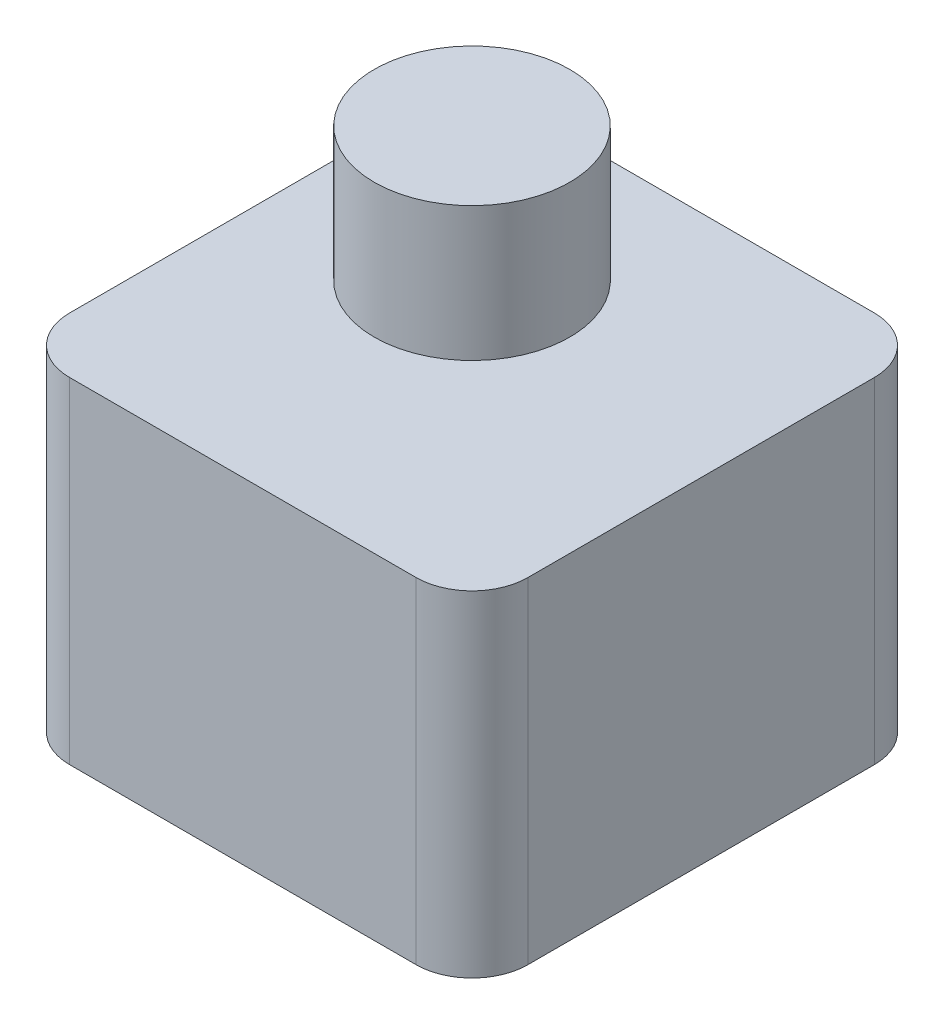
ISO-10303-21;
HEADER;
FILE_DESCRIPTION(('STEP AP214'),'2;1');
FILE_NAME('part.step','',(''),(''),'','','');
FILE_SCHEMA(('AUTOMOTIVE_DESIGN { 1 0 10303 214 1 1 1 1 }'));
ENDSEC;
DATA;
#1=APPLICATION_CONTEXT('core data for automotive mechanical design processes');
#2=APPLICATION_PROTOCOL_DEFINITION('international standard','automotive_design',2000,#1);
#3=PRODUCT_CONTEXT('',#1,'mechanical');
#4=PRODUCT('Part','Part','',(#3));
#5=PRODUCT_RELATED_PRODUCT_CATEGORY('part','',(#4));
#6=PRODUCT_DEFINITION_FORMATION('','',#4);
#7=PRODUCT_DEFINITION_CONTEXT('part definition',#1,'design');
#8=PRODUCT_DEFINITION('design','',#6,#7);
#9=PRODUCT_DEFINITION_SHAPE('','',#8);
#10=(LENGTH_UNIT() NAMED_UNIT(*) SI_UNIT(.MILLI.,.METRE.));
#11=(NAMED_UNIT(*) PLANE_ANGLE_UNIT() SI_UNIT($,.RADIAN.));
#12=(NAMED_UNIT(*) SI_UNIT($,.STERADIAN.) SOLID_ANGLE_UNIT());
#13=UNCERTAINTY_MEASURE_WITH_UNIT(LENGTH_MEASURE(1.E-05),#10,'distance_accuracy_value','');
#14=(GEOMETRIC_REPRESENTATION_CONTEXT(3) GLOBAL_UNCERTAINTY_ASSIGNED_CONTEXT((#13)) GLOBAL_UNIT_ASSIGNED_CONTEXT((#10,
#11,#12)) REPRESENTATION_CONTEXT('',''));
#15=CARTESIAN_POINT('',(0.,0.,0.));
#16=DIRECTION('',(0.,0.,1.));
#17=DIRECTION('',(1.,0.,0.));
#18=AXIS2_PLACEMENT_3D('',#15,#16,#17);
#19=CARTESIAN_POINT('',(20.5,47.,-20.5));
#20=DIRECTION('',(0.,-1.,0.));
#21=DIRECTION('',(0.,0.,-1.));
#22=AXIS2_PLACEMENT_3D('',#19,#20,#21);
#23=CYLINDRICAL_SURFACE('',#22,1.5);
#24=CARTESIAN_POINT('',(20.5,30.,-20.5));
#25=DIRECTION('',(0.,1.,0.));
#26=DIRECTION('',(0.,0.,1.));
#27=AXIS2_PLACEMENT_3D('',#24,#25,#26);
#28=CIRCLE('',#27,1.5);
#29=CARTESIAN_POINT('',(20.5,30.,-19.));
#30=VERTEX_POINT('',#29);
#31=EDGE_CURVE('E48',#30,#30,#28,.T.);
#32=ORIENTED_EDGE('',*,*,#31,.T.);
#33=EDGE_LOOP('',(#32));
#34=FACE_BOUND('',#33,.T.);
#35=CARTESIAN_POINT('',(20.5,35.,-20.5));
#36=DIRECTION('',(0.,1.,0.));
#37=DIRECTION('',(0.,0.,1.));
#38=AXIS2_PLACEMENT_3D('',#35,#36,#37);
#39=CIRCLE('',#38,1.5);
#40=CARTESIAN_POINT('',(20.5,35.,-19.));
#41=VERTEX_POINT('',#40);
#42=EDGE_CURVE('E11',#41,#41,#39,.T.);
#43=ORIENTED_EDGE('',*,*,#42,.F.);
#44=EDGE_LOOP('',(#43));
#45=FACE_BOUND('',#44,.T.);
#46=ADVANCED_FACE('F42',(#34,#45),#23,.T.);
#47=CARTESIAN_POINT('',(20.5,30.,-20.5));
#48=DIRECTION('',(0.,1.,0.));
#49=DIRECTION('',(0.,0.,1.));
#50=AXIS2_PLACEMENT_3D('',#47,#48,#49);
#51=PLANE('',#50);
#52=ORIENTED_EDGE('',*,*,#31,.F.);
#53=EDGE_LOOP('',(#52));
#54=FACE_BOUND('',#53,.T.);
#55=ADVANCED_FACE('F74',(#54),#51,.F.);
#56=CARTESIAN_POINT('',(20.5,47.,-20.5));
#57=DIRECTION('',(0.,-1.,0.));
#58=DIRECTION('',(0.,0.,-1.));
#59=AXIS2_PLACEMENT_3D('',#56,#57,#58);
#60=CYLINDRICAL_SURFACE('',#59,8.75);
#61=CARTESIAN_POINT('',(20.5,47.,-20.5));
#62=DIRECTION('',(0.,1.,0.));
#63=DIRECTION('',(0.,0.,1.));
#64=AXIS2_PLACEMENT_3D('',#61,#62,#63);
#65=CIRCLE('',#64,8.75);
#66=CARTESIAN_POINT('',(20.5,47.,-11.75));
#67=VERTEX_POINT('',#66);
#68=EDGE_CURVE('E52',#67,#67,#65,.T.);
#69=ORIENTED_EDGE('',*,*,#68,.F.);
#70=EDGE_LOOP('',(#69));
#71=FACE_BOUND('',#70,.T.);
#72=CARTESIAN_POINT('',(20.5,35.,-20.5));
#73=DIRECTION('',(0.,1.,0.));
#74=DIRECTION('',(0.,0.,1.));
#75=AXIS2_PLACEMENT_3D('',#72,#73,#74);
#76=CIRCLE('',#75,8.75);
#77=CARTESIAN_POINT('',(20.5,35.,-11.75));
#78=VERTEX_POINT('',#77);
#79=EDGE_CURVE('E56',#78,#78,#76,.T.);
#80=ORIENTED_EDGE('',*,*,#79,.T.);
#81=EDGE_LOOP('',(#80));
#82=FACE_BOUND('',#81,.T.);
#83=ADVANCED_FACE('F62',(#71,#82),#60,.T.);
#84=CARTESIAN_POINT('',(20.5,35.,-20.5));
#85=DIRECTION('',(0.,1.,0.));
#86=DIRECTION('',(0.,0.,1.));
#87=AXIS2_PLACEMENT_3D('',#84,#85,#86);
#88=PLANE('',#87);
#89=ORIENTED_EDGE('',*,*,#42,.T.);
#90=EDGE_LOOP('',(#89));
#91=FACE_BOUND('',#90,.T.);
#92=ORIENTED_EDGE('',*,*,#79,.F.);
#93=EDGE_LOOP('',(#92));
#94=FACE_BOUND('',#93,.T.);
#95=ADVANCED_FACE('F64',(#91,#94),#88,.F.);
#96=CARTESIAN_POINT('',(20.5,47.,-20.5));
#97=DIRECTION('',(0.,1.,0.));
#98=DIRECTION('',(0.,0.,1.));
#99=AXIS2_PLACEMENT_3D('',#96,#97,#98);
#100=PLANE('',#99);
#101=ORIENTED_EDGE('',*,*,#68,.T.);
#102=EDGE_LOOP('',(#101));
#103=FACE_BOUND('',#102,.T.);
#104=ADVANCED_FACE('F66',(#103),#100,.T.);
#105=CLOSED_SHELL('',(#46,#55,#83,#95,#104));
#106=MANIFOLD_SOLID_BREP('B2',#105);
#107=CARTESIAN_POINT('',(5.,30.,-5.));
#108=DIRECTION('',(0.,-1.,0.));
#109=DIRECTION('',(0.,0.,-1.));
#110=AXIS2_PLACEMENT_3D('',#107,#108,#109);
#111=CYLINDRICAL_SURFACE('',#110,5.);
#112=CARTESIAN_POINT('',(5.,0.,-5.));
#113=DIRECTION('',(0.,1.,0.));
#114=DIRECTION('',(0.,0.,1.));
#115=AXIS2_PLACEMENT_3D('',#112,#113,#114);
#116=CIRCLE('',#115,5.);
#117=CARTESIAN_POINT('',(0.,0.,-5.00000000000004));
#118=VERTEX_POINT('',#117);
#119=CARTESIAN_POINT('',(5.00000000000003,0.,0.));
#120=VERTEX_POINT('',#119);
#121=EDGE_CURVE('E211',#118,#120,#116,.T.);
#122=ORIENTED_EDGE('',*,*,#121,.T.);
#123=DIRECTION('',(0.,-1.,0.));
#124=VECTOR('',#123,1.);
#125=CARTESIAN_POINT('',(5.00000000000003,30.,0.));
#126=LINE('',#125,#124);
#127=CARTESIAN_POINT('',(5.00000000000003,30.,0.));
#128=VERTEX_POINT('',#127);
#129=EDGE_CURVE('E40',#128,#120,#126,.T.);
#130=ORIENTED_EDGE('',*,*,#129,.F.);
#131=CARTESIAN_POINT('',(5.,30.,-5.));
#132=DIRECTION('',(0.,1.,0.));
#133=DIRECTION('',(0.,0.,1.));
#134=AXIS2_PLACEMENT_3D('',#131,#132,#133);
#135=CIRCLE('',#134,5.);
#136=CARTESIAN_POINT('',(0.,30.,-5.00000000000004));
#137=VERTEX_POINT('',#136);
#138=EDGE_CURVE('E225',#137,#128,#135,.T.);
#139=ORIENTED_EDGE('',*,*,#138,.F.);
#140=DIRECTION('',(0.,-1.,0.));
#141=VECTOR('',#140,1.);
#142=CARTESIAN_POINT('',(0.,30.,-5.00000000000004));
#143=LINE('',#142,#141);
#144=EDGE_CURVE('E207',#137,#118,#143,.T.);
#145=ORIENTED_EDGE('',*,*,#144,.T.);
#146=EDGE_LOOP('',(#122,#130,#139,#145));
#147=FACE_BOUND('',#146,.T.);
#148=ADVANCED_FACE('F115',(#147),#111,.T.);
#149=CARTESIAN_POINT('',(5.00000000000003,30.,0.));
#150=DIRECTION('',(0.,0.,-1.));
#151=DIRECTION('',(-1.,0.,0.));
#152=AXIS2_PLACEMENT_3D('',#149,#150,#151);
#153=PLANE('',#152);
#154=DIRECTION('',(1.,0.,0.));
#155=VECTOR('',#154,1.);
#156=CARTESIAN_POINT('',(5.00000000000003,0.,0.));
#157=LINE('',#156,#155);
#158=CARTESIAN_POINT('',(36.,0.,0.));
#159=VERTEX_POINT('',#158);
#160=EDGE_CURVE('E214',#120,#159,#157,.T.);
#161=ORIENTED_EDGE('',*,*,#160,.T.);
#162=DIRECTION('',(0.,-1.,0.));
#163=VECTOR('',#162,1.);
#164=CARTESIAN_POINT('',(36.,30.,0.));
#165=LINE('',#164,#163);
#166=CARTESIAN_POINT('',(36.,30.,0.));
#167=VERTEX_POINT('',#166);
#168=EDGE_CURVE('E123',#167,#159,#165,.T.);
#169=ORIENTED_EDGE('',*,*,#168,.F.);
#170=DIRECTION('',(1.,0.,0.));
#171=VECTOR('',#170,1.);
#172=CARTESIAN_POINT('',(5.00000000000003,30.,0.));
#173=LINE('',#172,#171);
#174=EDGE_CURVE('E174',#128,#167,#173,.T.);
#175=ORIENTED_EDGE('',*,*,#174,.F.);
#176=ORIENTED_EDGE('',*,*,#129,.T.);
#177=EDGE_LOOP('',(#161,#169,#175,#176));
#178=FACE_BOUND('',#177,.T.);
#179=ADVANCED_FACE('F260',(#178),#153,.F.);
#180=CARTESIAN_POINT('',(36.,30.,-5.));
#181=DIRECTION('',(0.,-1.,0.));
#182=DIRECTION('',(0.,0.,-1.));
#183=AXIS2_PLACEMENT_3D('',#180,#181,#182);
#184=CYLINDRICAL_SURFACE('',#183,5.);
#185=CARTESIAN_POINT('',(36.,0.,-5.));
#186=DIRECTION('',(0.,1.,0.));
#187=DIRECTION('',(0.,0.,1.));
#188=AXIS2_PLACEMENT_3D('',#185,#186,#187);
#189=CIRCLE('',#188,5.);
#190=CARTESIAN_POINT('',(41.,0.,-5.00000000000004));
#191=VERTEX_POINT('',#190);
#192=EDGE_CURVE('E216',#159,#191,#189,.T.);
#193=ORIENTED_EDGE('',*,*,#192,.T.);
#194=DIRECTION('',(0.,-1.,0.));
#195=VECTOR('',#194,1.);
#196=CARTESIAN_POINT('',(41.,30.,-5.00000000000004));
#197=LINE('',#196,#195);
#198=CARTESIAN_POINT('',(41.,30.,-5.00000000000004));
#199=VERTEX_POINT('',#198);
#200=EDGE_CURVE('E232',#199,#191,#197,.T.);
#201=ORIENTED_EDGE('',*,*,#200,.F.);
#202=CARTESIAN_POINT('',(36.,30.,-5.));
#203=DIRECTION('',(0.,1.,0.));
#204=DIRECTION('',(0.,0.,1.));
#205=AXIS2_PLACEMENT_3D('',#202,#203,#204);
#206=CIRCLE('',#205,5.);
#207=EDGE_CURVE('E240',#167,#199,#206,.T.);
#208=ORIENTED_EDGE('',*,*,#207,.F.);
#209=ORIENTED_EDGE('',*,*,#168,.T.);
#210=EDGE_LOOP('',(#193,#201,#208,#209));
#211=FACE_BOUND('',#210,.T.);
#212=ADVANCED_FACE('F238',(#211),#184,.T.);
#213=CARTESIAN_POINT('',(41.,30.,-36.));
#214=DIRECTION('',(-1.,0.,0.));
#215=DIRECTION('',(0.,0.,1.));
#216=AXIS2_PLACEMENT_3D('',#213,#214,#215);
#217=PLANE('',#216);
#218=DIRECTION('',(0.,0.,-1.));
#219=VECTOR('',#218,1.);
#220=CARTESIAN_POINT('',(41.,0.,-36.));
#221=LINE('',#220,#219);
#222=CARTESIAN_POINT('',(41.,0.,-36.));
#223=VERTEX_POINT('',#222);
#224=EDGE_CURVE('E218',#191,#223,#221,.T.);
#225=ORIENTED_EDGE('',*,*,#224,.T.);
#226=DIRECTION('',(0.,-1.,0.));
#227=VECTOR('',#226,1.);
#228=CARTESIAN_POINT('',(41.,30.,-36.));
#229=LINE('',#228,#227);
#230=CARTESIAN_POINT('',(41.,30.,-36.));
#231=VERTEX_POINT('',#230);
#232=EDGE_CURVE('E229',#231,#223,#229,.T.);
#233=ORIENTED_EDGE('',*,*,#232,.F.);
#234=DIRECTION('',(0.,0.,-1.));
#235=VECTOR('',#234,1.);
#236=CARTESIAN_POINT('',(41.,30.,-36.));
#237=LINE('',#236,#235);
#238=EDGE_CURVE('E252',#199,#231,#237,.T.);
#239=ORIENTED_EDGE('',*,*,#238,.F.);
#240=ORIENTED_EDGE('',*,*,#200,.T.);
#241=EDGE_LOOP('',(#225,#233,#239,#240));
#242=FACE_BOUND('',#241,.T.);
#243=ADVANCED_FACE('F248',(#242),#217,.F.);
#244=CARTESIAN_POINT('',(36.,30.,-36.));
#245=DIRECTION('',(0.,-1.,0.));
#246=DIRECTION('',(0.,0.,-1.));
#247=AXIS2_PLACEMENT_3D('',#244,#245,#246);
#248=CYLINDRICAL_SURFACE('',#247,5.);
#249=CARTESIAN_POINT('',(36.,0.,-36.));
#250=DIRECTION('',(0.,1.,0.));
#251=DIRECTION('',(0.,0.,-1.));
#252=AXIS2_PLACEMENT_3D('',#249,#250,#251);
#253=CIRCLE('',#252,5.);
#254=CARTESIAN_POINT('',(36.,0.,-41.));
#255=VERTEX_POINT('',#254);
#256=EDGE_CURVE('E220',#223,#255,#253,.T.);
#257=ORIENTED_EDGE('',*,*,#256,.T.);
#258=DIRECTION('',(0.,-1.,0.));
#259=VECTOR('',#258,1.);
#260=CARTESIAN_POINT('',(36.,30.,-41.));
#261=LINE('',#260,#259);
#262=CARTESIAN_POINT('',(36.,30.,-41.));
#263=VERTEX_POINT('',#262);
#264=EDGE_CURVE('E202',#263,#255,#261,.T.);
#265=ORIENTED_EDGE('',*,*,#264,.F.);
#266=CARTESIAN_POINT('',(36.,30.,-36.));
#267=DIRECTION('',(0.,1.,0.));
#268=DIRECTION('',(0.,0.,-1.));
#269=AXIS2_PLACEMENT_3D('',#266,#267,#268);
#270=CIRCLE('',#269,5.);
#271=EDGE_CURVE('E193',#231,#263,#270,.T.);
#272=ORIENTED_EDGE('',*,*,#271,.F.);
#273=ORIENTED_EDGE('',*,*,#232,.T.);
#274=EDGE_LOOP('',(#257,#265,#272,#273));
#275=FACE_BOUND('',#274,.T.);
#276=ADVANCED_FACE('F251',(#275),#248,.T.);
#277=CARTESIAN_POINT('',(5.,30.,-41.));
#278=DIRECTION('',(0.,0.,1.));
#279=DIRECTION('',(1.,0.,0.));
#280=AXIS2_PLACEMENT_3D('',#277,#278,#279);
#281=PLANE('',#280);
#282=DIRECTION('',(-1.,0.,0.));
#283=VECTOR('',#282,1.);
#284=CARTESIAN_POINT('',(5.,0.,-41.));
#285=LINE('',#284,#283);
#286=CARTESIAN_POINT('',(5.,0.,-41.));
#287=VERTEX_POINT('',#286);
#288=EDGE_CURVE('E201',#255,#287,#285,.T.);
#289=ORIENTED_EDGE('',*,*,#288,.T.);
#290=DIRECTION('',(0.,-1.,0.));
#291=VECTOR('',#290,1.);
#292=CARTESIAN_POINT('',(5.,30.,-41.));
#293=LINE('',#292,#291);
#294=CARTESIAN_POINT('',(5.,30.,-41.));
#295=VERTEX_POINT('',#294);
#296=EDGE_CURVE('E198',#295,#287,#293,.T.);
#297=ORIENTED_EDGE('',*,*,#296,.F.);
#298=DIRECTION('',(-1.,0.,0.));
#299=VECTOR('',#298,1.);
#300=CARTESIAN_POINT('',(5.,30.,-41.));
#301=LINE('',#300,#299);
#302=EDGE_CURVE('E187',#263,#295,#301,.T.);
#303=ORIENTED_EDGE('',*,*,#302,.F.);
#304=ORIENTED_EDGE('',*,*,#264,.T.);
#305=EDGE_LOOP('',(#289,#297,#303,#304));
#306=FACE_BOUND('',#305,.T.);
#307=ADVANCED_FACE('F199',(#306),#281,.F.);
#308=CARTESIAN_POINT('',(5.,30.,-36.));
#309=DIRECTION('',(0.,-1.,0.));
#310=DIRECTION('',(0.,0.,-1.));
#311=AXIS2_PLACEMENT_3D('',#308,#309,#310);
#312=CYLINDRICAL_SURFACE('',#311,5.);
#313=CARTESIAN_POINT('',(5.,0.,-36.));
#314=DIRECTION('',(0.,1.,0.));
#315=DIRECTION('',(0.,0.,1.));
#316=AXIS2_PLACEMENT_3D('',#313,#314,#315);
#317=CIRCLE('',#316,5.);
#318=CARTESIAN_POINT('',(0.,0.,-36.));
#319=VERTEX_POINT('',#318);
#320=EDGE_CURVE('E160',#287,#319,#317,.T.);
#321=ORIENTED_EDGE('',*,*,#320,.T.);
#322=DIRECTION('',(0.,-1.,0.));
#323=VECTOR('',#322,1.);
#324=CARTESIAN_POINT('',(0.,30.,-36.));
#325=LINE('',#324,#323);
#326=CARTESIAN_POINT('',(0.,30.,-36.));
#327=VERTEX_POINT('',#326);
#328=EDGE_CURVE('E203',#327,#319,#325,.T.);
#329=ORIENTED_EDGE('',*,*,#328,.F.);
#330=CARTESIAN_POINT('',(5.,30.,-36.));
#331=DIRECTION('',(0.,1.,0.));
#332=DIRECTION('',(0.,0.,1.));
#333=AXIS2_PLACEMENT_3D('',#330,#331,#332);
#334=CIRCLE('',#333,5.);
#335=EDGE_CURVE('E191',#295,#327,#334,.T.);
#336=ORIENTED_EDGE('',*,*,#335,.F.);
#337=ORIENTED_EDGE('',*,*,#296,.T.);
#338=EDGE_LOOP('',(#321,#329,#336,#337));
#339=FACE_BOUND('',#338,.T.);
#340=ADVANCED_FACE('F205',(#339),#312,.T.);
#341=CARTESIAN_POINT('',(0.,30.,-36.));
#342=DIRECTION('',(1.,0.,0.));
#343=DIRECTION('',(0.,0.,-1.));
#344=AXIS2_PLACEMENT_3D('',#341,#342,#343);
#345=PLANE('',#344);
#346=DIRECTION('',(0.,0.,1.));
#347=VECTOR('',#346,1.);
#348=CARTESIAN_POINT('',(0.,0.,-36.));
#349=LINE('',#348,#347);
#350=EDGE_CURVE('E166',#319,#118,#349,.T.);
#351=ORIENTED_EDGE('',*,*,#350,.T.);
#352=ORIENTED_EDGE('',*,*,#144,.F.);
#353=DIRECTION('',(0.,0.,1.));
#354=VECTOR('',#353,1.);
#355=CARTESIAN_POINT('',(0.,30.,-36.));
#356=LINE('',#355,#354);
#357=EDGE_CURVE('E131',#327,#137,#356,.T.);
#358=ORIENTED_EDGE('',*,*,#357,.F.);
#359=ORIENTED_EDGE('',*,*,#328,.T.);
#360=EDGE_LOOP('',(#351,#352,#358,#359));
#361=FACE_BOUND('',#360,.T.);
#362=ADVANCED_FACE('F276',(#361),#345,.F.);
#363=CARTESIAN_POINT('',(5.,30.,-5.));
#364=DIRECTION('',(0.,1.,0.));
#365=DIRECTION('',(0.,0.,1.));
#366=AXIS2_PLACEMENT_3D('',#363,#364,#365);
#367=PLANE('',#366);
#368=ORIENTED_EDGE('',*,*,#138,.T.);
#369=ORIENTED_EDGE('',*,*,#174,.T.);
#370=ORIENTED_EDGE('',*,*,#207,.T.);
#371=ORIENTED_EDGE('',*,*,#238,.T.);
#372=ORIENTED_EDGE('',*,*,#271,.T.);
#373=ORIENTED_EDGE('',*,*,#302,.T.);
#374=ORIENTED_EDGE('',*,*,#335,.T.);
#375=ORIENTED_EDGE('',*,*,#357,.T.);
#376=EDGE_LOOP('',(#368,#369,#370,#371,#372,#373,#374,#375));
#377=FACE_BOUND('',#376,.T.);
#378=ADVANCED_FACE('F189',(#377),#367,.T.);
#379=CARTESIAN_POINT('',(5.,0.,-5.));
#380=DIRECTION('',(0.,1.,0.));
#381=DIRECTION('',(0.,0.,1.));
#382=AXIS2_PLACEMENT_3D('',#379,#380,#381);
#383=PLANE('',#382);
#384=ORIENTED_EDGE('',*,*,#121,.F.);
#385=ORIENTED_EDGE('',*,*,#350,.F.);
#386=ORIENTED_EDGE('',*,*,#320,.F.);
#387=ORIENTED_EDGE('',*,*,#288,.F.);
#388=ORIENTED_EDGE('',*,*,#256,.F.);
#389=ORIENTED_EDGE('',*,*,#224,.F.);
#390=ORIENTED_EDGE('',*,*,#192,.F.);
#391=ORIENTED_EDGE('',*,*,#160,.F.);
#392=EDGE_LOOP('',(#384,#385,#386,#387,#388,#389,#390,#391));
#393=FACE_BOUND('',#392,.T.);
#394=ADVANCED_FACE('F244',(#393),#383,.F.);
#395=CLOSED_SHELL('',(#148,#179,#212,#243,#276,#307,#340,#362,#378,#394));
#396=MANIFOLD_SOLID_BREP('B6',#395);
#397=ADVANCED_BREP_SHAPE_REPRESENTATION('',(#18,#106,#396),#14);
#398=SHAPE_DEFINITION_REPRESENTATION(#9,#397);
ENDSEC;
END-ISO-10303-21;
